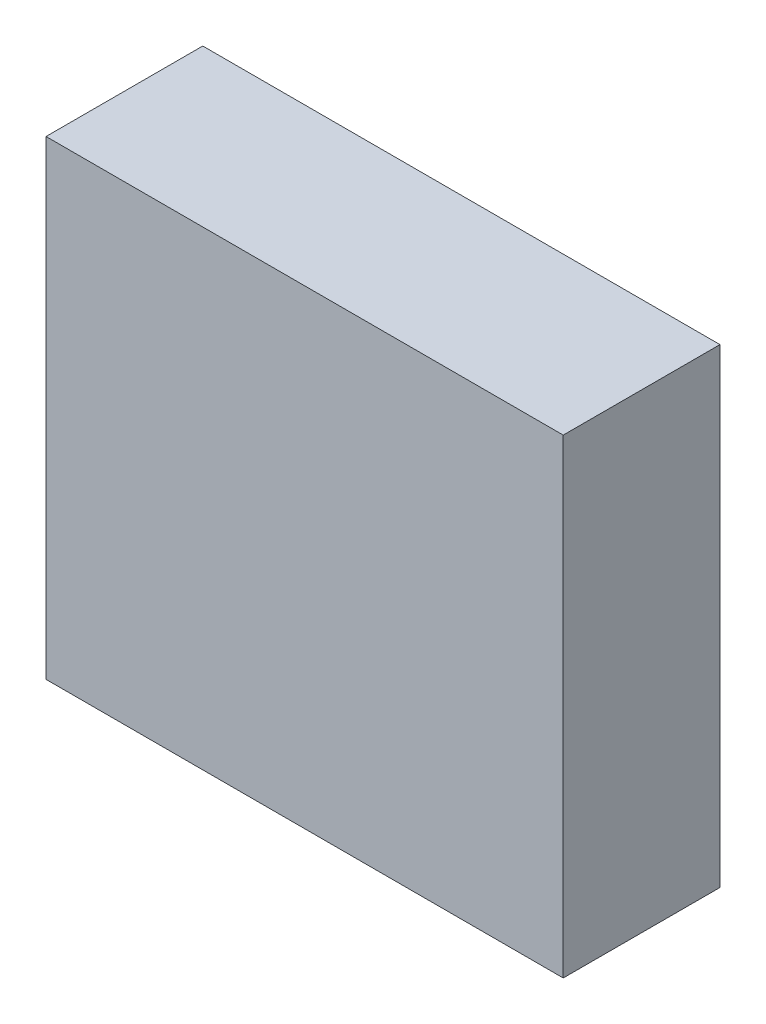
ISO-10303-21;
HEADER;
FILE_DESCRIPTION(('STEP AP214'),'2;1');
FILE_NAME('part.step','',(''),(''),'','','');
FILE_SCHEMA(('AUTOMOTIVE_DESIGN { 1 0 10303 214 1 1 1 1 }'));
ENDSEC;
DATA;
#1=APPLICATION_CONTEXT('core data for automotive mechanical design processes');
#2=APPLICATION_PROTOCOL_DEFINITION('international standard','automotive_design',2000,#1);
#3=PRODUCT_CONTEXT('',#1,'mechanical');
#4=PRODUCT('Part','Part','',(#3));
#5=PRODUCT_RELATED_PRODUCT_CATEGORY('part','',(#4));
#6=PRODUCT_DEFINITION_FORMATION('','',#4);
#7=PRODUCT_DEFINITION_CONTEXT('part definition',#1,'design');
#8=PRODUCT_DEFINITION('design','',#6,#7);
#9=PRODUCT_DEFINITION_SHAPE('','',#8);
#10=(LENGTH_UNIT() NAMED_UNIT(*) SI_UNIT(.MILLI.,.METRE.));
#11=(NAMED_UNIT(*) PLANE_ANGLE_UNIT() SI_UNIT($,.RADIAN.));
#12=(NAMED_UNIT(*) SI_UNIT($,.STERADIAN.) SOLID_ANGLE_UNIT());
#13=UNCERTAINTY_MEASURE_WITH_UNIT(LENGTH_MEASURE(1.E-05),#10,'distance_accuracy_value','');
#14=(GEOMETRIC_REPRESENTATION_CONTEXT(3) GLOBAL_UNCERTAINTY_ASSIGNED_CONTEXT((#13)) GLOBAL_UNIT_ASSIGNED_CONTEXT((#10,
#11,#12)) REPRESENTATION_CONTEXT('',''));
#15=CARTESIAN_POINT('',(0.,0.,0.));
#16=DIRECTION('',(0.,0.,1.));
#17=DIRECTION('',(1.,0.,0.));
#18=AXIS2_PLACEMENT_3D('',#15,#16,#17);
#19=CARTESIAN_POINT('',(0.,0.,1.));
#20=DIRECTION('',(0.,0.,1.));
#21=DIRECTION('',(1.,0.,0.));
#22=AXIS2_PLACEMENT_3D('',#19,#20,#21);
#23=PLANE('',#22);
#24=DIRECTION('',(1.,0.,0.));
#25=VECTOR('',#24,1.);
#26=CARTESIAN_POINT('',(1.65,1.5,1.));
#27=LINE('',#26,#25);
#28=CARTESIAN_POINT('',(-1.65,1.5,1.));
#29=VERTEX_POINT('',#28);
#30=CARTESIAN_POINT('',(1.65,1.5,1.));
#31=VERTEX_POINT('',#30);
#32=EDGE_CURVE('E68',#29,#31,#27,.T.);
#33=ORIENTED_EDGE('',*,*,#32,.F.);
#34=DIRECTION('',(0.,1.,0.));
#35=VECTOR('',#34,1.);
#36=CARTESIAN_POINT('',(-1.65,1.5,1.));
#37=LINE('',#36,#35);
#38=CARTESIAN_POINT('',(-1.65,-1.5,1.));
#39=VERTEX_POINT('',#38);
#40=EDGE_CURVE('E20',#39,#29,#37,.T.);
#41=ORIENTED_EDGE('',*,*,#40,.F.);
#42=DIRECTION('',(1.,0.,0.));
#43=VECTOR('',#42,1.);
#44=CARTESIAN_POINT('',(-1.65,-1.5,1.));
#45=LINE('',#44,#43);
#46=CARTESIAN_POINT('',(1.65,-1.5,1.));
#47=VERTEX_POINT('',#46);
#48=EDGE_CURVE('E58',#47,#39,#45,.F.);
#49=ORIENTED_EDGE('',*,*,#48,.F.);
#50=DIRECTION('',(0.,1.,0.));
#51=VECTOR('',#50,1.);
#52=CARTESIAN_POINT('',(1.65,-1.5,1.));
#53=LINE('',#52,#51);
#54=EDGE_CURVE('E53',#31,#47,#53,.F.);
#55=ORIENTED_EDGE('',*,*,#54,.F.);
#56=EDGE_LOOP('',(#33,#41,#49,#55));
#57=FACE_BOUND('',#56,.T.);
#58=ADVANCED_FACE('F17',(#57),#23,.T.);
#59=CARTESIAN_POINT('',(-1.65,1.5,0.));
#60=DIRECTION('',(-1.,0.,0.));
#61=DIRECTION('',(0.,0.,1.));
#62=AXIS2_PLACEMENT_3D('',#59,#60,#61);
#63=PLANE('',#62);
#64=DIRECTION('',(0.,0.,1.));
#65=VECTOR('',#64,1.);
#66=CARTESIAN_POINT('',(-1.65,1.5,0.));
#67=LINE('',#66,#65);
#68=CARTESIAN_POINT('',(-1.65,1.5,0.));
#69=VERTEX_POINT('',#68);
#70=EDGE_CURVE('E79',#69,#29,#67,.T.);
#71=ORIENTED_EDGE('',*,*,#70,.F.);
#72=DIRECTION('',(0.,1.,0.));
#73=VECTOR('',#72,1.);
#74=CARTESIAN_POINT('',(-1.65,0.,0.));
#75=LINE('',#74,#73);
#76=CARTESIAN_POINT('',(-1.65,-1.5,0.));
#77=VERTEX_POINT('',#76);
#78=EDGE_CURVE('E74',#69,#77,#75,.F.);
#79=ORIENTED_EDGE('',*,*,#78,.T.);
#80=DIRECTION('',(0.,0.,-1.));
#81=VECTOR('',#80,1.);
#82=CARTESIAN_POINT('',(-1.65,-1.5,0.));
#83=LINE('',#82,#81);
#84=EDGE_CURVE('E63',#39,#77,#83,.T.);
#85=ORIENTED_EDGE('',*,*,#84,.F.);
#86=ORIENTED_EDGE('',*,*,#40,.T.);
#87=EDGE_LOOP('',(#71,#79,#85,#86));
#88=FACE_BOUND('',#87,.T.);
#89=ADVANCED_FACE('F73',(#88),#63,.T.);
#90=CARTESIAN_POINT('',(-1.65,-1.5,0.));
#91=DIRECTION('',(0.,-1.,0.));
#92=DIRECTION('',(0.,0.,-1.));
#93=AXIS2_PLACEMENT_3D('',#90,#91,#92);
#94=PLANE('',#93);
#95=ORIENTED_EDGE('',*,*,#84,.T.);
#96=DIRECTION('',(1.,0.,0.));
#97=VECTOR('',#96,1.);
#98=CARTESIAN_POINT('',(0.,-1.5,0.));
#99=LINE('',#98,#97);
#100=CARTESIAN_POINT('',(1.65,-1.5,0.));
#101=VERTEX_POINT('',#100);
#102=EDGE_CURVE('E84',#77,#101,#99,.T.);
#103=ORIENTED_EDGE('',*,*,#102,.T.);
#104=DIRECTION('',(0.,0.,-1.));
#105=VECTOR('',#104,1.);
#106=CARTESIAN_POINT('',(1.65,-1.5,0.));
#107=LINE('',#106,#105);
#108=EDGE_CURVE('E65',#47,#101,#107,.T.);
#109=ORIENTED_EDGE('',*,*,#108,.F.);
#110=ORIENTED_EDGE('',*,*,#48,.T.);
#111=EDGE_LOOP('',(#95,#103,#109,#110));
#112=FACE_BOUND('',#111,.T.);
#113=ADVANCED_FACE('F60',(#112),#94,.T.);
#114=CARTESIAN_POINT('',(1.65,-1.5,0.));
#115=DIRECTION('',(1.,0.,0.));
#116=DIRECTION('',(0.,0.,-1.));
#117=AXIS2_PLACEMENT_3D('',#114,#115,#116);
#118=PLANE('',#117);
#119=ORIENTED_EDGE('',*,*,#108,.T.);
#120=DIRECTION('',(0.,1.,0.));
#121=VECTOR('',#120,1.);
#122=CARTESIAN_POINT('',(1.65,0.,0.));
#123=LINE('',#122,#121);
#124=CARTESIAN_POINT('',(1.65,1.5,0.));
#125=VERTEX_POINT('',#124);
#126=EDGE_CURVE('E26',#101,#125,#123,.T.);
#127=ORIENTED_EDGE('',*,*,#126,.T.);
#128=DIRECTION('',(0.,0.,1.));
#129=VECTOR('',#128,1.);
#130=CARTESIAN_POINT('',(1.65,1.5,0.));
#131=LINE('',#130,#129);
#132=EDGE_CURVE('E34',#31,#125,#131,.F.);
#133=ORIENTED_EDGE('',*,*,#132,.F.);
#134=ORIENTED_EDGE('',*,*,#54,.T.);
#135=EDGE_LOOP('',(#119,#127,#133,#134));
#136=FACE_BOUND('',#135,.T.);
#137=ADVANCED_FACE('F88',(#136),#118,.T.);
#138=CARTESIAN_POINT('',(1.65,1.5,0.));
#139=DIRECTION('',(0.,1.,0.));
#140=DIRECTION('',(0.,0.,1.));
#141=AXIS2_PLACEMENT_3D('',#138,#139,#140);
#142=PLANE('',#141);
#143=ORIENTED_EDGE('',*,*,#132,.T.);
#144=DIRECTION('',(1.,0.,0.));
#145=VECTOR('',#144,1.);
#146=CARTESIAN_POINT('',(0.,1.5,0.));
#147=LINE('',#146,#145);
#148=EDGE_CURVE('E11',#125,#69,#147,.F.);
#149=ORIENTED_EDGE('',*,*,#148,.T.);
#150=ORIENTED_EDGE('',*,*,#70,.T.);
#151=ORIENTED_EDGE('',*,*,#32,.T.);
#152=EDGE_LOOP('',(#143,#149,#150,#151));
#153=FACE_BOUND('',#152,.T.);
#154=ADVANCED_FACE('F91',(#153),#142,.T.);
#155=CARTESIAN_POINT('',(0.,0.,0.));
#156=DIRECTION('',(0.,0.,1.));
#157=DIRECTION('',(1.,0.,0.));
#158=AXIS2_PLACEMENT_3D('',#155,#156,#157);
#159=PLANE('',#158);
#160=ORIENTED_EDGE('',*,*,#126,.F.);
#161=ORIENTED_EDGE('',*,*,#102,.F.);
#162=ORIENTED_EDGE('',*,*,#78,.F.);
#163=ORIENTED_EDGE('',*,*,#148,.F.);
#164=EDGE_LOOP('',(#160,#161,#162,#163));
#165=FACE_BOUND('',#164,.T.);
#166=ADVANCED_FACE('F90',(#165),#159,.F.);
#167=CLOSED_SHELL('',(#58,#89,#113,#137,#154,#166));
#168=MANIFOLD_SOLID_BREP('B1',#167);
#169=ADVANCED_BREP_SHAPE_REPRESENTATION('',(#18,#168),#14);
#170=SHAPE_DEFINITION_REPRESENTATION(#9,#169);
ENDSEC;
END-ISO-10303-21;
